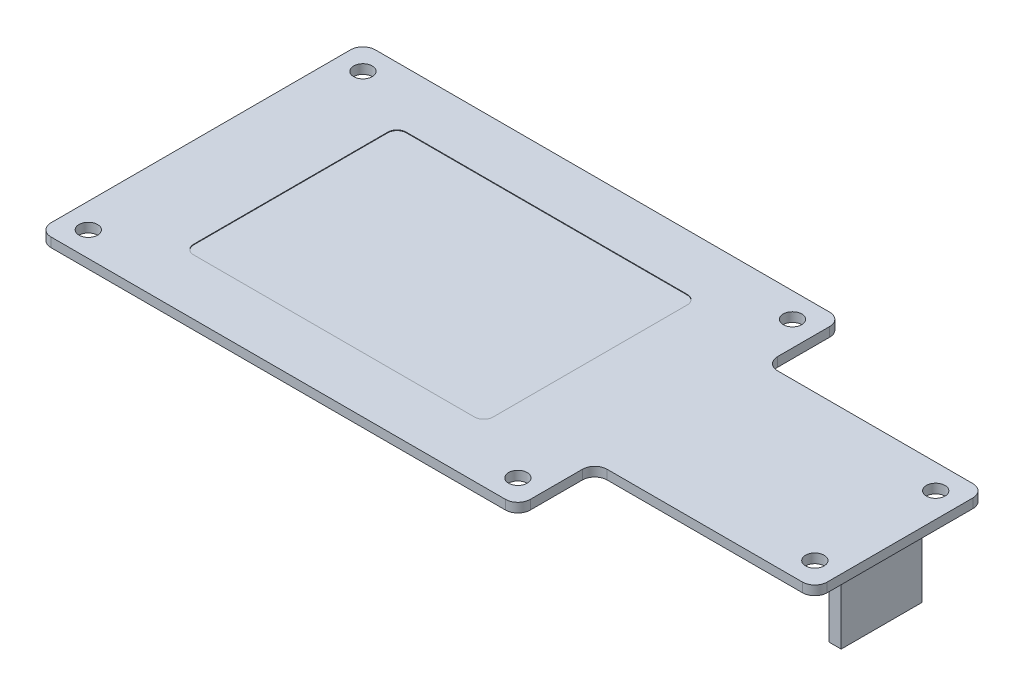
ISO-10303-21;
HEADER;
FILE_DESCRIPTION(('STEP AP214'),'2;1');
FILE_NAME('part.step','',(''),(''),'','','');
FILE_SCHEMA(('AUTOMOTIVE_DESIGN { 1 0 10303 214 1 1 1 1 }'));
ENDSEC;
DATA;
#1=APPLICATION_CONTEXT('core data for automotive mechanical design processes');
#2=APPLICATION_PROTOCOL_DEFINITION('international standard','automotive_design',2000,#1);
#3=PRODUCT_CONTEXT('',#1,'mechanical');
#4=PRODUCT('Part','Part','',(#3));
#5=PRODUCT_RELATED_PRODUCT_CATEGORY('part','',(#4));
#6=PRODUCT_DEFINITION_FORMATION('','',#4);
#7=PRODUCT_DEFINITION_CONTEXT('part definition',#1,'design');
#8=PRODUCT_DEFINITION('design','',#6,#7);
#9=PRODUCT_DEFINITION_SHAPE('','',#8);
#10=(LENGTH_UNIT() NAMED_UNIT(*) SI_UNIT(.MILLI.,.METRE.));
#11=(NAMED_UNIT(*) PLANE_ANGLE_UNIT() SI_UNIT($,.RADIAN.));
#12=(NAMED_UNIT(*) SI_UNIT($,.STERADIAN.) SOLID_ANGLE_UNIT());
#13=UNCERTAINTY_MEASURE_WITH_UNIT(LENGTH_MEASURE(1.E-05),#10,'distance_accuracy_value','');
#14=(GEOMETRIC_REPRESENTATION_CONTEXT(3) GLOBAL_UNCERTAINTY_ASSIGNED_CONTEXT((#13)) GLOBAL_UNIT_ASSIGNED_CONTEXT((#10,
#11,#12)) REPRESENTATION_CONTEXT('',''));
#15=CARTESIAN_POINT('',(0.,0.,0.));
#16=DIRECTION('',(0.,0.,1.));
#17=DIRECTION('',(1.,0.,0.));
#18=AXIS2_PLACEMENT_3D('',#15,#16,#17);
#19=CARTESIAN_POINT('',(0.,-0.75,0.));
#20=DIRECTION('',(0.,1.,0.));
#21=DIRECTION('',(0.,0.,1.));
#22=AXIS2_PLACEMENT_3D('',#19,#20,#21);
#23=PLANE('',#22);
#24=DIRECTION('',(0.,0.,1.));
#25=VECTOR('',#24,1.);
#26=CARTESIAN_POINT('',(-38.65,-0.75,26.15));
#27=LINE('',#26,#25);
#28=CARTESIAN_POINT('',(-38.65,-0.75,-24.15));
#29=VERTEX_POINT('',#28);
#30=CARTESIAN_POINT('',(-38.65,-0.75,24.15));
#31=VERTEX_POINT('',#30);
#32=EDGE_CURVE('E360',#29,#31,#27,.T.);
#33=ORIENTED_EDGE('',*,*,#32,.F.);
#34=CARTESIAN_POINT('',(-36.65,-0.75,-24.15));
#35=DIRECTION('',(0.,1.,0.));
#36=DIRECTION('',(0.,0.,1.));
#37=AXIS2_PLACEMENT_3D('',#34,#35,#36);
#38=CIRCLE('',#37,2.);
#39=CARTESIAN_POINT('',(-36.65,-0.75,-26.15));
#40=VERTEX_POINT('',#39);
#41=EDGE_CURVE('E391',#29,#40,#38,.F.);
#42=ORIENTED_EDGE('',*,*,#41,.T.);
#43=DIRECTION('',(-1.,0.,0.));
#44=VECTOR('',#43,1.);
#45=CARTESIAN_POINT('',(-38.65,-0.75,-26.15));
#46=LINE('',#45,#44);
#47=CARTESIAN_POINT('',(36.65,-0.75,-26.15));
#48=VERTEX_POINT('',#47);
#49=EDGE_CURVE('E357',#48,#40,#46,.T.);
#50=ORIENTED_EDGE('',*,*,#49,.F.);
#51=CARTESIAN_POINT('',(36.65,-0.75,-24.15));
#52=DIRECTION('',(0.,1.,0.));
#53=DIRECTION('',(0.,0.,1.));
#54=AXIS2_PLACEMENT_3D('',#51,#52,#53);
#55=CIRCLE('',#54,2.);
#56=CARTESIAN_POINT('',(38.65,-0.75,-24.15));
#57=VERTEX_POINT('',#56);
#58=EDGE_CURVE('E387',#48,#57,#55,.F.);
#59=ORIENTED_EDGE('',*,*,#58,.T.);
#60=DIRECTION('',(0.,0.,-1.));
#61=VECTOR('',#60,1.);
#62=CARTESIAN_POINT('',(38.65,-0.75,-26.15));
#63=LINE('',#62,#61);
#64=CARTESIAN_POINT('',(38.65,-0.75,-15.75));
#65=VERTEX_POINT('',#64);
#66=EDGE_CURVE('E328',#65,#57,#63,.T.);
#67=ORIENTED_EDGE('',*,*,#66,.F.);
#68=CARTESIAN_POINT('',(40.65,-0.75,-15.75));
#69=DIRECTION('',(0.,1.,0.));
#70=DIRECTION('',(0.,0.,1.));
#71=AXIS2_PLACEMENT_3D('',#68,#69,#70);
#72=CIRCLE('',#71,2.);
#73=CARTESIAN_POINT('',(40.65,-0.75,-13.75));
#74=VERTEX_POINT('',#73);
#75=EDGE_CURVE('E440',#65,#74,#72,.T.);
#76=ORIENTED_EDGE('',*,*,#75,.T.);
#77=DIRECTION('',(-1.,0.,0.));
#78=VECTOR('',#77,1.);
#79=CARTESIAN_POINT('',(38.65,-0.75,-13.75));
#80=LINE('',#79,#78);
#81=CARTESIAN_POINT('',(72.15,-0.75,-13.75));
#82=VERTEX_POINT('',#81);
#83=EDGE_CURVE('E333',#82,#74,#80,.T.);
#84=ORIENTED_EDGE('',*,*,#83,.F.);
#85=CARTESIAN_POINT('',(72.15,-0.75,-11.75));
#86=DIRECTION('',(0.,1.,0.));
#87=DIRECTION('',(0.,0.,1.));
#88=AXIS2_PLACEMENT_3D('',#85,#86,#87);
#89=CIRCLE('',#88,2.);
#90=CARTESIAN_POINT('',(74.15,-0.75,-11.75));
#91=VERTEX_POINT('',#90);
#92=EDGE_CURVE('E385',#82,#91,#89,.F.);
#93=ORIENTED_EDGE('',*,*,#92,.T.);
#94=DIRECTION('',(0.,0.,-1.));
#95=VECTOR('',#94,1.);
#96=CARTESIAN_POINT('',(74.15,-0.75,-13.75));
#97=LINE('',#96,#95);
#98=CARTESIAN_POINT('',(74.15,-0.75,11.75));
#99=VERTEX_POINT('',#98);
#100=EDGE_CURVE('E372',#99,#91,#97,.T.);
#101=ORIENTED_EDGE('',*,*,#100,.F.);
#102=CARTESIAN_POINT('',(72.15,-0.75,11.75));
#103=DIRECTION('',(0.,1.,0.));
#104=DIRECTION('',(0.,0.,1.));
#105=AXIS2_PLACEMENT_3D('',#102,#103,#104);
#106=CIRCLE('',#105,2.);
#107=CARTESIAN_POINT('',(72.15,-0.75,13.75));
#108=VERTEX_POINT('',#107);
#109=EDGE_CURVE('E383',#99,#108,#106,.F.);
#110=ORIENTED_EDGE('',*,*,#109,.T.);
#111=DIRECTION('',(1.,0.,0.));
#112=VECTOR('',#111,1.);
#113=CARTESIAN_POINT('',(74.15,-0.75,13.75));
#114=LINE('',#113,#112);
#115=CARTESIAN_POINT('',(40.65,-0.75,13.75));
#116=VERTEX_POINT('',#115);
#117=EDGE_CURVE('E369',#116,#108,#114,.T.);
#118=ORIENTED_EDGE('',*,*,#117,.F.);
#119=CARTESIAN_POINT('',(40.65,-0.75,15.75));
#120=DIRECTION('',(0.,1.,0.));
#121=DIRECTION('',(0.,0.,1.));
#122=AXIS2_PLACEMENT_3D('',#119,#120,#121);
#123=CIRCLE('',#122,2.);
#124=CARTESIAN_POINT('',(38.65,-0.75,15.75));
#125=VERTEX_POINT('',#124);
#126=EDGE_CURVE('E444',#116,#125,#123,.T.);
#127=ORIENTED_EDGE('',*,*,#126,.T.);
#128=DIRECTION('',(0.,0.,-1.));
#129=VECTOR('',#128,1.);
#130=CARTESIAN_POINT('',(38.65,-0.75,13.75));
#131=LINE('',#130,#129);
#132=CARTESIAN_POINT('',(38.65,-0.75,24.15));
#133=VERTEX_POINT('',#132);
#134=EDGE_CURVE('E366',#133,#125,#131,.T.);
#135=ORIENTED_EDGE('',*,*,#134,.F.);
#136=CARTESIAN_POINT('',(36.65,-0.75,24.15));
#137=DIRECTION('',(0.,1.,0.));
#138=DIRECTION('',(0.,0.,1.));
#139=AXIS2_PLACEMENT_3D('',#136,#137,#138);
#140=CIRCLE('',#139,2.);
#141=CARTESIAN_POINT('',(36.65,-0.75,26.15));
#142=VERTEX_POINT('',#141);
#143=EDGE_CURVE('E381',#133,#142,#140,.F.);
#144=ORIENTED_EDGE('',*,*,#143,.T.);
#145=DIRECTION('',(1.,0.,0.));
#146=VECTOR('',#145,1.);
#147=CARTESIAN_POINT('',(38.65,-0.75,26.15));
#148=LINE('',#147,#146);
#149=CARTESIAN_POINT('',(-36.65,-0.75,26.15));
#150=VERTEX_POINT('',#149);
#151=EDGE_CURVE('E363',#150,#142,#148,.T.);
#152=ORIENTED_EDGE('',*,*,#151,.F.);
#153=CARTESIAN_POINT('',(-36.65,-0.75,24.15));
#154=DIRECTION('',(0.,1.,0.));
#155=DIRECTION('',(0.,0.,1.));
#156=AXIS2_PLACEMENT_3D('',#153,#154,#155);
#157=CIRCLE('',#156,2.);
#158=EDGE_CURVE('E389',#150,#31,#157,.F.);
#159=ORIENTED_EDGE('',*,*,#158,.T.);
#160=EDGE_LOOP('',(#33,#42,#50,#59,#67,#76,#84,#93,#101,#110,#118,#127,#135,#144,#152,#159));
#161=FACE_BOUND('',#160,.T.);
#162=CARTESIAN_POINT('',(-34.65,-0.75,-22.15));
#163=DIRECTION('',(0.,1.,0.));
#164=DIRECTION('',(0.,0.,1.));
#165=AXIS2_PLACEMENT_3D('',#162,#163,#164);
#166=CIRCLE('',#165,1.5);
#167=CARTESIAN_POINT('',(-34.65,-0.75,-20.65));
#168=VERTEX_POINT('',#167);
#169=EDGE_CURVE('E325',#168,#168,#166,.F.);
#170=ORIENTED_EDGE('',*,*,#169,.F.);
#171=EDGE_LOOP('',(#170));
#172=FACE_BOUND('',#171,.T.);
#173=CARTESIAN_POINT('',(34.65,-0.75,-22.15));
#174=DIRECTION('',(0.,1.,0.));
#175=DIRECTION('',(0.,0.,1.));
#176=AXIS2_PLACEMENT_3D('',#173,#174,#175);
#177=CIRCLE('',#176,1.5);
#178=CARTESIAN_POINT('',(34.65,-0.75,-20.65));
#179=VERTEX_POINT('',#178);
#180=EDGE_CURVE('E314',#179,#179,#177,.F.);
#181=ORIENTED_EDGE('',*,*,#180,.F.);
#182=EDGE_LOOP('',(#181));
#183=FACE_BOUND('',#182,.T.);
#184=CARTESIAN_POINT('',(34.65,-0.75,22.15));
#185=DIRECTION('',(0.,1.,0.));
#186=DIRECTION('',(0.,0.,1.));
#187=AXIS2_PLACEMENT_3D('',#184,#185,#186);
#188=CIRCLE('',#187,1.5);
#189=CARTESIAN_POINT('',(34.65,-0.75,23.65));
#190=VERTEX_POINT('',#189);
#191=EDGE_CURVE('E315',#190,#190,#188,.F.);
#192=ORIENTED_EDGE('',*,*,#191,.F.);
#193=EDGE_LOOP('',(#192));
#194=FACE_BOUND('',#193,.T.);
#195=CARTESIAN_POINT('',(-34.65,-0.75,22.15));
#196=DIRECTION('',(0.,1.,0.));
#197=DIRECTION('',(0.,0.,1.));
#198=AXIS2_PLACEMENT_3D('',#195,#196,#197);
#199=CIRCLE('',#198,1.5);
#200=CARTESIAN_POINT('',(-34.65,-0.75,23.65));
#201=VERTEX_POINT('',#200);
#202=EDGE_CURVE('E296',#201,#201,#199,.F.);
#203=ORIENTED_EDGE('',*,*,#202,.F.);
#204=EDGE_LOOP('',(#203));
#205=FACE_BOUND('',#204,.T.);
#206=CARTESIAN_POINT('',(70.15,-0.75,-9.75));
#207=DIRECTION('',(0.,1.,0.));
#208=DIRECTION('',(0.,0.,1.));
#209=AXIS2_PLACEMENT_3D('',#206,#207,#208);
#210=CIRCLE('',#209,1.5);
#211=CARTESIAN_POINT('',(70.15,-0.75,-8.25));
#212=VERTEX_POINT('',#211);
#213=EDGE_CURVE('E297',#212,#212,#210,.F.);
#214=ORIENTED_EDGE('',*,*,#213,.F.);
#215=EDGE_LOOP('',(#214));
#216=FACE_BOUND('',#215,.T.);
#217=CARTESIAN_POINT('',(70.15,-0.75,9.75));
#218=DIRECTION('',(0.,1.,0.));
#219=DIRECTION('',(0.,0.,1.));
#220=AXIS2_PLACEMENT_3D('',#217,#218,#219);
#221=CIRCLE('',#220,1.5);
#222=CARTESIAN_POINT('',(70.15,-0.75,11.25));
#223=VERTEX_POINT('',#222);
#224=EDGE_CURVE('E304',#223,#223,#221,.F.);
#225=ORIENTED_EDGE('',*,*,#224,.F.);
#226=EDGE_LOOP('',(#225));
#227=FACE_BOUND('',#226,.T.);
#228=DIRECTION('',(0.,0.,1.));
#229=VECTOR('',#228,1.);
#230=CARTESIAN_POINT('',(71.15,-0.75,6.5));
#231=LINE('',#230,#229);
#232=CARTESIAN_POINT('',(71.15,-0.75,-6.5));
#233=VERTEX_POINT('',#232);
#234=CARTESIAN_POINT('',(71.15,-0.75,6.5));
#235=VERTEX_POINT('',#234);
#236=EDGE_CURVE('E239',#233,#235,#231,.T.);
#237=ORIENTED_EDGE('',*,*,#236,.F.);
#238=DIRECTION('',(1.,0.,0.));
#239=VECTOR('',#238,1.);
#240=CARTESIAN_POINT('',(71.15,-0.75,-6.5));
#241=LINE('',#240,#239);
#242=CARTESIAN_POINT('',(69.15,-0.75,-6.5));
#243=VERTEX_POINT('',#242);
#244=EDGE_CURVE('E236',#243,#233,#241,.T.);
#245=ORIENTED_EDGE('',*,*,#244,.F.);
#246=DIRECTION('',(0.,0.,-1.));
#247=VECTOR('',#246,1.);
#248=CARTESIAN_POINT('',(69.15,-0.75,6.5));
#249=LINE('',#248,#247);
#250=CARTESIAN_POINT('',(69.15,-0.75,6.5));
#251=VERTEX_POINT('',#250);
#252=EDGE_CURVE('E54',#251,#243,#249,.T.);
#253=ORIENTED_EDGE('',*,*,#252,.F.);
#254=DIRECTION('',(-1.,0.,0.));
#255=VECTOR('',#254,1.);
#256=CARTESIAN_POINT('',(71.15,-0.75,6.5));
#257=LINE('',#256,#255);
#258=EDGE_CURVE('E49',#235,#251,#257,.T.);
#259=ORIENTED_EDGE('',*,*,#258,.F.);
#260=EDGE_LOOP('',(#237,#245,#253,#259));
#261=FACE_BOUND('',#260,.T.);
#262=ADVANCED_FACE('F34',(#161,#172,#183,#194,#205,#216,#227,#261),#23,.F.);
#263=CARTESIAN_POINT('',(38.65,0.75,-26.15));
#264=DIRECTION('',(-1.,0.,0.));
#265=DIRECTION('',(0.,0.,1.));
#266=AXIS2_PLACEMENT_3D('',#263,#264,#265);
#267=PLANE('',#266);
#268=DIRECTION('',(0.,0.,-1.));
#269=VECTOR('',#268,1.);
#270=CARTESIAN_POINT('',(38.65,0.75,-26.15));
#271=LINE('',#270,#269);
#272=CARTESIAN_POINT('',(38.65,0.75,-15.75));
#273=VERTEX_POINT('',#272);
#274=CARTESIAN_POINT('',(38.65,0.75,-24.15));
#275=VERTEX_POINT('',#274);
#276=EDGE_CURVE('E329',#273,#275,#271,.T.);
#277=ORIENTED_EDGE('',*,*,#276,.F.);
#278=DIRECTION('',(0.,-1.,0.));
#279=VECTOR('',#278,1.);
#280=CARTESIAN_POINT('',(38.65,-0.75,-15.75));
#281=LINE('',#280,#279);
#282=EDGE_CURVE('E412',#273,#65,#281,.T.);
#283=ORIENTED_EDGE('',*,*,#282,.T.);
#284=ORIENTED_EDGE('',*,*,#66,.T.);
#285=DIRECTION('',(0.,-1.,0.));
#286=VECTOR('',#285,1.);
#287=CARTESIAN_POINT('',(38.65,0.75,-24.15));
#288=LINE('',#287,#286);
#289=EDGE_CURVE('E410',#57,#275,#288,.F.);
#290=ORIENTED_EDGE('',*,*,#289,.T.);
#291=EDGE_LOOP('',(#277,#283,#284,#290));
#292=FACE_BOUND('',#291,.T.);
#293=ADVANCED_FACE('F505',(#292),#267,.F.);
#294=CARTESIAN_POINT('',(-38.65,0.75,-26.15));
#295=DIRECTION('',(0.,0.,1.));
#296=DIRECTION('',(1.,0.,0.));
#297=AXIS2_PLACEMENT_3D('',#294,#295,#296);
#298=PLANE('',#297);
#299=ORIENTED_EDGE('',*,*,#49,.T.);
#300=DIRECTION('',(0.,-1.,0.));
#301=VECTOR('',#300,1.);
#302=CARTESIAN_POINT('',(-36.65,0.75,-26.15));
#303=LINE('',#302,#301);
#304=CARTESIAN_POINT('',(-36.65,0.75,-26.15));
#305=VERTEX_POINT('',#304);
#306=EDGE_CURVE('E396',#40,#305,#303,.F.);
#307=ORIENTED_EDGE('',*,*,#306,.T.);
#308=DIRECTION('',(-1.,0.,0.));
#309=VECTOR('',#308,1.);
#310=CARTESIAN_POINT('',(-38.65,0.75,-26.15));
#311=LINE('',#310,#309);
#312=CARTESIAN_POINT('',(36.65,0.75,-26.15));
#313=VERTEX_POINT('',#312);
#314=EDGE_CURVE('E332',#313,#305,#311,.T.);
#315=ORIENTED_EDGE('',*,*,#314,.F.);
#316=DIRECTION('',(0.,-1.,0.));
#317=VECTOR('',#316,1.);
#318=CARTESIAN_POINT('',(36.65,0.75,-26.15));
#319=LINE('',#318,#317);
#320=EDGE_CURVE('E393',#313,#48,#319,.T.);
#321=ORIENTED_EDGE('',*,*,#320,.T.);
#322=EDGE_LOOP('',(#299,#307,#315,#321));
#323=FACE_BOUND('',#322,.T.);
#324=ADVANCED_FACE('F511',(#323),#298,.F.);
#325=CARTESIAN_POINT('',(-38.65,0.75,26.15));
#326=DIRECTION('',(1.,0.,0.));
#327=DIRECTION('',(0.,0.,-1.));
#328=AXIS2_PLACEMENT_3D('',#325,#326,#327);
#329=PLANE('',#328);
#330=DIRECTION('',(0.,0.,1.));
#331=VECTOR('',#330,1.);
#332=CARTESIAN_POINT('',(-38.65,0.75,26.15));
#333=LINE('',#332,#331);
#334=CARTESIAN_POINT('',(-38.65,0.75,-24.15));
#335=VERTEX_POINT('',#334);
#336=CARTESIAN_POINT('',(-38.65,0.75,24.15));
#337=VERTEX_POINT('',#336);
#338=EDGE_CURVE('E336',#335,#337,#333,.T.);
#339=ORIENTED_EDGE('',*,*,#338,.F.);
#340=DIRECTION('',(0.,-1.,0.));
#341=VECTOR('',#340,1.);
#342=CARTESIAN_POINT('',(-38.65,0.75,-24.15));
#343=LINE('',#342,#341);
#344=EDGE_CURVE('E378',#335,#29,#343,.T.);
#345=ORIENTED_EDGE('',*,*,#344,.T.);
#346=ORIENTED_EDGE('',*,*,#32,.T.);
#347=DIRECTION('',(0.,-1.,0.));
#348=VECTOR('',#347,1.);
#349=CARTESIAN_POINT('',(-38.65,0.75,24.15));
#350=LINE('',#349,#348);
#351=EDGE_CURVE('E354',#31,#337,#350,.F.);
#352=ORIENTED_EDGE('',*,*,#351,.T.);
#353=EDGE_LOOP('',(#339,#345,#346,#352));
#354=FACE_BOUND('',#353,.T.);
#355=ADVANCED_FACE('F538',(#354),#329,.F.);
#356=CARTESIAN_POINT('',(38.65,0.75,26.15));
#357=DIRECTION('',(0.,0.,-1.));
#358=DIRECTION('',(-1.,0.,0.));
#359=AXIS2_PLACEMENT_3D('',#356,#357,#358);
#360=PLANE('',#359);
#361=DIRECTION('',(1.,0.,0.));
#362=VECTOR('',#361,1.);
#363=CARTESIAN_POINT('',(38.65,0.75,26.15));
#364=LINE('',#363,#362);
#365=CARTESIAN_POINT('',(-36.65,0.75,26.15));
#366=VERTEX_POINT('',#365);
#367=CARTESIAN_POINT('',(36.65,0.75,26.15));
#368=VERTEX_POINT('',#367);
#369=EDGE_CURVE('E339',#366,#368,#364,.T.);
#370=ORIENTED_EDGE('',*,*,#369,.F.);
#371=DIRECTION('',(0.,-1.,0.));
#372=VECTOR('',#371,1.);
#373=CARTESIAN_POINT('',(-36.65,0.75,26.15));
#374=LINE('',#373,#372);
#375=EDGE_CURVE('E422',#366,#150,#374,.T.);
#376=ORIENTED_EDGE('',*,*,#375,.T.);
#377=ORIENTED_EDGE('',*,*,#151,.T.);
#378=DIRECTION('',(0.,-1.,0.));
#379=VECTOR('',#378,1.);
#380=CARTESIAN_POINT('',(36.65,0.75,26.15));
#381=LINE('',#380,#379);
#382=EDGE_CURVE('E420',#142,#368,#381,.F.);
#383=ORIENTED_EDGE('',*,*,#382,.T.);
#384=EDGE_LOOP('',(#370,#376,#377,#383));
#385=FACE_BOUND('',#384,.T.);
#386=ADVANCED_FACE('F534',(#385),#360,.F.);
#387=CARTESIAN_POINT('',(38.65,0.75,13.75));
#388=DIRECTION('',(-1.,0.,0.));
#389=DIRECTION('',(0.,0.,1.));
#390=AXIS2_PLACEMENT_3D('',#387,#388,#389);
#391=PLANE('',#390);
#392=ORIENTED_EDGE('',*,*,#134,.T.);
#393=DIRECTION('',(0.,-1.,0.));
#394=VECTOR('',#393,1.);
#395=CARTESIAN_POINT('',(38.65,0.75,15.75));
#396=LINE('',#395,#394);
#397=CARTESIAN_POINT('',(38.65,0.75,15.75));
#398=VERTEX_POINT('',#397);
#399=EDGE_CURVE('E438',#125,#398,#396,.F.);
#400=ORIENTED_EDGE('',*,*,#399,.T.);
#401=DIRECTION('',(0.,0.,-1.));
#402=VECTOR('',#401,1.);
#403=CARTESIAN_POINT('',(38.65,0.75,13.75));
#404=LINE('',#403,#402);
#405=CARTESIAN_POINT('',(38.65,0.75,24.15));
#406=VERTEX_POINT('',#405);
#407=EDGE_CURVE('E342',#406,#398,#404,.T.);
#408=ORIENTED_EDGE('',*,*,#407,.F.);
#409=DIRECTION('',(0.,-1.,0.));
#410=VECTOR('',#409,1.);
#411=CARTESIAN_POINT('',(38.65,0.75,24.15));
#412=LINE('',#411,#410);
#413=EDGE_CURVE('E435',#406,#133,#412,.T.);
#414=ORIENTED_EDGE('',*,*,#413,.T.);
#415=EDGE_LOOP('',(#392,#400,#408,#414));
#416=FACE_BOUND('',#415,.T.);
#417=ADVANCED_FACE('F530',(#416),#391,.F.);
#418=CARTESIAN_POINT('',(74.15,0.75,13.75));
#419=DIRECTION('',(0.,0.,-1.));
#420=DIRECTION('',(-1.,0.,0.));
#421=AXIS2_PLACEMENT_3D('',#418,#419,#420);
#422=PLANE('',#421);
#423=ORIENTED_EDGE('',*,*,#117,.T.);
#424=DIRECTION('',(0.,-1.,0.));
#425=VECTOR('',#424,1.);
#426=CARTESIAN_POINT('',(72.15,0.75,13.75));
#427=LINE('',#426,#425);
#428=CARTESIAN_POINT('',(72.15,0.75,13.75));
#429=VERTEX_POINT('',#428);
#430=EDGE_CURVE('E433',#108,#429,#427,.F.);
#431=ORIENTED_EDGE('',*,*,#430,.T.);
#432=DIRECTION('',(1.,0.,0.));
#433=VECTOR('',#432,1.);
#434=CARTESIAN_POINT('',(74.15,0.75,13.75));
#435=LINE('',#434,#433);
#436=CARTESIAN_POINT('',(40.65,0.75,13.75));
#437=VERTEX_POINT('',#436);
#438=EDGE_CURVE('E345',#437,#429,#435,.T.);
#439=ORIENTED_EDGE('',*,*,#438,.F.);
#440=DIRECTION('',(0.,-1.,0.));
#441=VECTOR('',#440,1.);
#442=CARTESIAN_POINT('',(40.65,-0.75,13.75));
#443=LINE('',#442,#441);
#444=EDGE_CURVE('E430',#437,#116,#443,.T.);
#445=ORIENTED_EDGE('',*,*,#444,.T.);
#446=EDGE_LOOP('',(#423,#431,#439,#445));
#447=FACE_BOUND('',#446,.T.);
#448=ADVANCED_FACE('F526',(#447),#422,.F.);
#449=CARTESIAN_POINT('',(74.15,0.75,-13.75));
#450=DIRECTION('',(-1.,0.,0.));
#451=DIRECTION('',(0.,0.,1.));
#452=AXIS2_PLACEMENT_3D('',#449,#450,#451);
#453=PLANE('',#452);
#454=ORIENTED_EDGE('',*,*,#100,.T.);
#455=DIRECTION('',(0.,-1.,0.));
#456=VECTOR('',#455,1.);
#457=CARTESIAN_POINT('',(74.15,0.75,-11.75));
#458=LINE('',#457,#456);
#459=CARTESIAN_POINT('',(74.15,0.75,-11.75));
#460=VERTEX_POINT('',#459);
#461=EDGE_CURVE('E428',#91,#460,#458,.F.);
#462=ORIENTED_EDGE('',*,*,#461,.T.);
#463=DIRECTION('',(0.,0.,-1.));
#464=VECTOR('',#463,1.);
#465=CARTESIAN_POINT('',(74.15,0.75,-13.75));
#466=LINE('',#465,#464);
#467=CARTESIAN_POINT('',(74.15,0.75,11.75));
#468=VERTEX_POINT('',#467);
#469=EDGE_CURVE('E348',#468,#460,#466,.T.);
#470=ORIENTED_EDGE('',*,*,#469,.F.);
#471=DIRECTION('',(0.,-1.,0.));
#472=VECTOR('',#471,1.);
#473=CARTESIAN_POINT('',(74.15,0.75,11.75));
#474=LINE('',#473,#472);
#475=EDGE_CURVE('E425',#468,#99,#474,.T.);
#476=ORIENTED_EDGE('',*,*,#475,.T.);
#477=EDGE_LOOP('',(#454,#462,#470,#476));
#478=FACE_BOUND('',#477,.T.);
#479=ADVANCED_FACE('F522',(#478),#453,.F.);
#480=CARTESIAN_POINT('',(38.65,0.75,-13.75));
#481=DIRECTION('',(0.,0.,1.));
#482=DIRECTION('',(1.,0.,0.));
#483=AXIS2_PLACEMENT_3D('',#480,#481,#482);
#484=PLANE('',#483);
#485=ORIENTED_EDGE('',*,*,#83,.T.);
#486=DIRECTION('',(0.,-1.,0.));
#487=VECTOR('',#486,1.);
#488=CARTESIAN_POINT('',(40.65,0.75,-13.75));
#489=LINE('',#488,#487);
#490=CARTESIAN_POINT('',(40.65,0.75,-13.75));
#491=VERTEX_POINT('',#490);
#492=EDGE_CURVE('E418',#74,#491,#489,.F.);
#493=ORIENTED_EDGE('',*,*,#492,.T.);
#494=DIRECTION('',(-1.,0.,0.));
#495=VECTOR('',#494,1.);
#496=CARTESIAN_POINT('',(38.65,0.75,-13.75));
#497=LINE('',#496,#495);
#498=CARTESIAN_POINT('',(72.15,0.75,-13.75));
#499=VERTEX_POINT('',#498);
#500=EDGE_CURVE('E351',#499,#491,#497,.T.);
#501=ORIENTED_EDGE('',*,*,#500,.F.);
#502=DIRECTION('',(0.,-1.,0.));
#503=VECTOR('',#502,1.);
#504=CARTESIAN_POINT('',(72.15,0.75,-13.75));
#505=LINE('',#504,#503);
#506=EDGE_CURVE('E415',#499,#82,#505,.T.);
#507=ORIENTED_EDGE('',*,*,#506,.T.);
#508=EDGE_LOOP('',(#485,#493,#501,#507));
#509=FACE_BOUND('',#508,.T.);
#510=ADVANCED_FACE('F519',(#509),#484,.F.);
#511=CARTESIAN_POINT('',(0.,0.75,0.));
#512=DIRECTION('',(0.,1.,0.));
#513=DIRECTION('',(0.,0.,1.));
#514=AXIS2_PLACEMENT_3D('',#511,#512,#513);
#515=PLANE('',#514);
#516=CARTESIAN_POINT('',(-22.65,0.75,15.65));
#517=DIRECTION('',(0.,1.,0.));
#518=DIRECTION('',(0.,0.,1.));
#519=AXIS2_PLACEMENT_3D('',#516,#517,#518);
#520=CIRCLE('',#519,1.5);
#521=CARTESIAN_POINT('',(-24.15,0.75,15.65));
#522=VERTEX_POINT('',#521);
#523=CARTESIAN_POINT('',(-22.65,0.75,17.15));
#524=VERTEX_POINT('',#523);
#525=EDGE_CURVE('E11',#522,#524,#520,.T.);
#526=ORIENTED_EDGE('',*,*,#525,.F.);
#527=DIRECTION('',(0.,0.,1.));
#528=VECTOR('',#527,1.);
#529=CARTESIAN_POINT('',(-24.15,0.75,0.));
#530=LINE('',#529,#528);
#531=CARTESIAN_POINT('',(-24.15,0.75,-15.65));
#532=VERTEX_POINT('',#531);
#533=EDGE_CURVE('E42',#532,#522,#530,.T.);
#534=ORIENTED_EDGE('',*,*,#533,.F.);
#535=CARTESIAN_POINT('',(-22.65,0.75,-15.65));
#536=DIRECTION('',(0.,1.,0.));
#537=DIRECTION('',(0.,0.,1.));
#538=AXIS2_PLACEMENT_3D('',#535,#536,#537);
#539=CIRCLE('',#538,1.5);
#540=CARTESIAN_POINT('',(-22.65,0.75,-17.15));
#541=VERTEX_POINT('',#540);
#542=EDGE_CURVE('E458',#541,#532,#539,.T.);
#543=ORIENTED_EDGE('',*,*,#542,.F.);
#544=DIRECTION('',(-1.,0.,0.));
#545=VECTOR('',#544,1.);
#546=CARTESIAN_POINT('',(0.,0.75,-17.15));
#547=LINE('',#546,#545);
#548=CARTESIAN_POINT('',(22.65,0.75,-17.15));
#549=VERTEX_POINT('',#548);
#550=EDGE_CURVE('E456',#549,#541,#547,.T.);
#551=ORIENTED_EDGE('',*,*,#550,.F.);
#552=CARTESIAN_POINT('',(22.65,0.75,-15.65));
#553=DIRECTION('',(0.,1.,0.));
#554=DIRECTION('',(0.,0.,1.));
#555=AXIS2_PLACEMENT_3D('',#552,#553,#554);
#556=CIRCLE('',#555,1.5);
#557=CARTESIAN_POINT('',(24.15,0.75,-15.65));
#558=VERTEX_POINT('',#557);
#559=EDGE_CURVE('E454',#558,#549,#556,.T.);
#560=ORIENTED_EDGE('',*,*,#559,.F.);
#561=DIRECTION('',(0.,0.,-1.));
#562=VECTOR('',#561,1.);
#563=CARTESIAN_POINT('',(24.15,0.75,0.));
#564=LINE('',#563,#562);
#565=CARTESIAN_POINT('',(24.15,0.75,15.65));
#566=VERTEX_POINT('',#565);
#567=EDGE_CURVE('E452',#566,#558,#564,.T.);
#568=ORIENTED_EDGE('',*,*,#567,.F.);
#569=CARTESIAN_POINT('',(22.65,0.75,15.65));
#570=DIRECTION('',(0.,1.,0.));
#571=DIRECTION('',(0.,0.,1.));
#572=AXIS2_PLACEMENT_3D('',#569,#570,#571);
#573=CIRCLE('',#572,1.5);
#574=CARTESIAN_POINT('',(22.65,0.75,17.15));
#575=VERTEX_POINT('',#574);
#576=EDGE_CURVE('E450',#575,#566,#573,.T.);
#577=ORIENTED_EDGE('',*,*,#576,.F.);
#578=DIRECTION('',(1.,0.,0.));
#579=VECTOR('',#578,1.);
#580=CARTESIAN_POINT('',(0.,0.75,17.15));
#581=LINE('',#580,#579);
#582=EDGE_CURVE('E448',#524,#575,#581,.T.);
#583=ORIENTED_EDGE('',*,*,#582,.F.);
#584=EDGE_LOOP('',(#526,#534,#543,#551,#560,#568,#577,#583));
#585=FACE_BOUND('',#584,.T.);
#586=CARTESIAN_POINT('',(70.15,0.75,9.75));
#587=DIRECTION('',(0.,1.,0.));
#588=DIRECTION('',(0.,0.,1.));
#589=AXIS2_PLACEMENT_3D('',#586,#587,#588);
#590=CIRCLE('',#589,1.5);
#591=CARTESIAN_POINT('',(70.15,0.75,11.25));
#592=VERTEX_POINT('',#591);
#593=EDGE_CURVE('E273',#592,#592,#590,.T.);
#594=ORIENTED_EDGE('',*,*,#593,.F.);
#595=EDGE_LOOP('',(#594));
#596=FACE_BOUND('',#595,.T.);
#597=CARTESIAN_POINT('',(70.15,0.75,-9.75));
#598=DIRECTION('',(0.,1.,0.));
#599=DIRECTION('',(0.,0.,1.));
#600=AXIS2_PLACEMENT_3D('',#597,#598,#599);
#601=CIRCLE('',#600,1.5);
#602=CARTESIAN_POINT('',(70.15,0.75,-8.25));
#603=VERTEX_POINT('',#602);
#604=EDGE_CURVE('E301',#603,#603,#601,.T.);
#605=ORIENTED_EDGE('',*,*,#604,.F.);
#606=EDGE_LOOP('',(#605));
#607=FACE_BOUND('',#606,.T.);
#608=CARTESIAN_POINT('',(-34.65,0.75,22.15));
#609=DIRECTION('',(0.,1.,0.));
#610=DIRECTION('',(0.,0.,1.));
#611=AXIS2_PLACEMENT_3D('',#608,#609,#610);
#612=CIRCLE('',#611,1.5);
#613=CARTESIAN_POINT('',(-34.65,0.75,23.65));
#614=VERTEX_POINT('',#613);
#615=EDGE_CURVE('E293',#614,#614,#612,.T.);
#616=ORIENTED_EDGE('',*,*,#615,.F.);
#617=EDGE_LOOP('',(#616));
#618=FACE_BOUND('',#617,.T.);
#619=CARTESIAN_POINT('',(34.65,0.75,22.15));
#620=DIRECTION('',(0.,1.,0.));
#621=DIRECTION('',(0.,0.,1.));
#622=AXIS2_PLACEMENT_3D('',#619,#620,#621);
#623=CIRCLE('',#622,1.5);
#624=CARTESIAN_POINT('',(34.65,0.75,23.65));
#625=VERTEX_POINT('',#624);
#626=EDGE_CURVE('E300',#625,#625,#623,.T.);
#627=ORIENTED_EDGE('',*,*,#626,.F.);
#628=EDGE_LOOP('',(#627));
#629=FACE_BOUND('',#628,.T.);
#630=CARTESIAN_POINT('',(34.65,0.75,-22.15));
#631=DIRECTION('',(0.,1.,0.));
#632=DIRECTION('',(0.,0.,1.));
#633=AXIS2_PLACEMENT_3D('',#630,#631,#632);
#634=CIRCLE('',#633,1.5);
#635=CARTESIAN_POINT('',(34.65,0.75,-20.65));
#636=VERTEX_POINT('',#635);
#637=EDGE_CURVE('E311',#636,#636,#634,.T.);
#638=ORIENTED_EDGE('',*,*,#637,.F.);
#639=EDGE_LOOP('',(#638));
#640=FACE_BOUND('',#639,.T.);
#641=CARTESIAN_POINT('',(-34.65,0.75,-22.15));
#642=DIRECTION('',(0.,1.,0.));
#643=DIRECTION('',(0.,0.,1.));
#644=AXIS2_PLACEMENT_3D('',#641,#642,#643);
#645=CIRCLE('',#644,1.5);
#646=CARTESIAN_POINT('',(-34.65,0.75,-20.65));
#647=VERTEX_POINT('',#646);
#648=EDGE_CURVE('E318',#647,#647,#645,.T.);
#649=ORIENTED_EDGE('',*,*,#648,.F.);
#650=EDGE_LOOP('',(#649));
#651=FACE_BOUND('',#650,.T.);
#652=ORIENTED_EDGE('',*,*,#314,.T.);
#653=CARTESIAN_POINT('',(-36.65,0.75,-24.15));
#654=DIRECTION('',(0.,1.,0.));
#655=DIRECTION('',(0.,0.,1.));
#656=AXIS2_PLACEMENT_3D('',#653,#654,#655);
#657=CIRCLE('',#656,2.);
#658=EDGE_CURVE('E408',#305,#335,#657,.T.);
#659=ORIENTED_EDGE('',*,*,#658,.T.);
#660=ORIENTED_EDGE('',*,*,#338,.T.);
#661=CARTESIAN_POINT('',(-36.65,0.75,24.15));
#662=DIRECTION('',(0.,1.,0.));
#663=DIRECTION('',(0.,0.,1.));
#664=AXIS2_PLACEMENT_3D('',#661,#662,#663);
#665=CIRCLE('',#664,2.);
#666=EDGE_CURVE('E406',#337,#366,#665,.T.);
#667=ORIENTED_EDGE('',*,*,#666,.T.);
#668=ORIENTED_EDGE('',*,*,#369,.T.);
#669=CARTESIAN_POINT('',(36.65,0.75,24.15));
#670=DIRECTION('',(0.,1.,0.));
#671=DIRECTION('',(0.,0.,1.));
#672=AXIS2_PLACEMENT_3D('',#669,#670,#671);
#673=CIRCLE('',#672,2.);
#674=EDGE_CURVE('E398',#368,#406,#673,.T.);
#675=ORIENTED_EDGE('',*,*,#674,.T.);
#676=ORIENTED_EDGE('',*,*,#407,.T.);
#677=CARTESIAN_POINT('',(40.65,0.75,15.75));
#678=DIRECTION('',(0.,1.,0.));
#679=DIRECTION('',(0.,0.,1.));
#680=AXIS2_PLACEMENT_3D('',#677,#678,#679);
#681=CIRCLE('',#680,2.);
#682=EDGE_CURVE('E446',#398,#437,#681,.F.);
#683=ORIENTED_EDGE('',*,*,#682,.T.);
#684=ORIENTED_EDGE('',*,*,#438,.T.);
#685=CARTESIAN_POINT('',(72.15,0.75,11.75));
#686=DIRECTION('',(0.,1.,0.));
#687=DIRECTION('',(0.,0.,1.));
#688=AXIS2_PLACEMENT_3D('',#685,#686,#687);
#689=CIRCLE('',#688,2.);
#690=EDGE_CURVE('E400',#429,#468,#689,.T.);
#691=ORIENTED_EDGE('',*,*,#690,.T.);
#692=ORIENTED_EDGE('',*,*,#469,.T.);
#693=CARTESIAN_POINT('',(72.15,0.75,-11.75));
#694=DIRECTION('',(0.,1.,0.));
#695=DIRECTION('',(0.,0.,1.));
#696=AXIS2_PLACEMENT_3D('',#693,#694,#695);
#697=CIRCLE('',#696,2.);
#698=EDGE_CURVE('E402',#460,#499,#697,.T.);
#699=ORIENTED_EDGE('',*,*,#698,.T.);
#700=ORIENTED_EDGE('',*,*,#500,.T.);
#701=CARTESIAN_POINT('',(40.65,0.75,-15.75));
#702=DIRECTION('',(0.,1.,0.));
#703=DIRECTION('',(0.,0.,1.));
#704=AXIS2_PLACEMENT_3D('',#701,#702,#703);
#705=CIRCLE('',#704,2.);
#706=EDGE_CURVE('E442',#491,#273,#705,.F.);
#707=ORIENTED_EDGE('',*,*,#706,.T.);
#708=ORIENTED_EDGE('',*,*,#276,.T.);
#709=CARTESIAN_POINT('',(36.65,0.75,-24.15));
#710=DIRECTION('',(0.,1.,0.));
#711=DIRECTION('',(0.,0.,1.));
#712=AXIS2_PLACEMENT_3D('',#709,#710,#711);
#713=CIRCLE('',#712,2.);
#714=EDGE_CURVE('E404',#275,#313,#713,.T.);
#715=ORIENTED_EDGE('',*,*,#714,.T.);
#716=EDGE_LOOP('',(#652,#659,#660,#667,#668,#675,#676,#683,#684,#691,#692,#699,#700,#707,#708,#715));
#717=FACE_BOUND('',#716,.T.);
#718=ADVANCED_FACE('F470',(#585,#596,#607,#618,#629,#640,#651,#717),#515,.T.);
#719=CARTESIAN_POINT('',(-36.65,0.75,-24.15));
#720=DIRECTION('',(0.,-1.,0.));
#721=DIRECTION('',(0.,0.,-1.));
#722=AXIS2_PLACEMENT_3D('',#719,#720,#721);
#723=CYLINDRICAL_SURFACE('',#722,2.);
#724=ORIENTED_EDGE('',*,*,#658,.F.);
#725=ORIENTED_EDGE('',*,*,#306,.F.);
#726=ORIENTED_EDGE('',*,*,#41,.F.);
#727=ORIENTED_EDGE('',*,*,#344,.F.);
#728=EDGE_LOOP('',(#724,#725,#726,#727));
#729=FACE_BOUND('',#728,.T.);
#730=ADVANCED_FACE('F546',(#729),#723,.T.);
#731=CARTESIAN_POINT('',(40.65,0.75,-15.75));
#732=DIRECTION('',(0.,1.,0.));
#733=DIRECTION('',(0.,0.,1.));
#734=AXIS2_PLACEMENT_3D('',#731,#732,#733);
#735=CYLINDRICAL_SURFACE('',#734,2.);
#736=ORIENTED_EDGE('',*,*,#706,.F.);
#737=ORIENTED_EDGE('',*,*,#492,.F.);
#738=ORIENTED_EDGE('',*,*,#75,.F.);
#739=ORIENTED_EDGE('',*,*,#282,.F.);
#740=EDGE_LOOP('',(#736,#737,#738,#739));
#741=FACE_BOUND('',#740,.T.);
#742=ADVANCED_FACE('F549',(#741),#735,.F.);
#743=CARTESIAN_POINT('',(-36.65,0.75,24.15));
#744=DIRECTION('',(0.,-1.,0.));
#745=DIRECTION('',(0.,0.,-1.));
#746=AXIS2_PLACEMENT_3D('',#743,#744,#745);
#747=CYLINDRICAL_SURFACE('',#746,2.);
#748=ORIENTED_EDGE('',*,*,#666,.F.);
#749=ORIENTED_EDGE('',*,*,#351,.F.);
#750=ORIENTED_EDGE('',*,*,#158,.F.);
#751=ORIENTED_EDGE('',*,*,#375,.F.);
#752=EDGE_LOOP('',(#748,#749,#750,#751));
#753=FACE_BOUND('',#752,.T.);
#754=ADVANCED_FACE('F553',(#753),#747,.T.);
#755=CARTESIAN_POINT('',(36.65,0.75,-24.15));
#756=DIRECTION('',(0.,-1.,0.));
#757=DIRECTION('',(0.,0.,-1.));
#758=AXIS2_PLACEMENT_3D('',#755,#756,#757);
#759=CYLINDRICAL_SURFACE('',#758,2.);
#760=ORIENTED_EDGE('',*,*,#714,.F.);
#761=ORIENTED_EDGE('',*,*,#289,.F.);
#762=ORIENTED_EDGE('',*,*,#58,.F.);
#763=ORIENTED_EDGE('',*,*,#320,.F.);
#764=EDGE_LOOP('',(#760,#761,#762,#763));
#765=FACE_BOUND('',#764,.T.);
#766=ADVANCED_FACE('F557',(#765),#759,.T.);
#767=CARTESIAN_POINT('',(72.15,0.75,-11.75));
#768=DIRECTION('',(0.,-1.,0.));
#769=DIRECTION('',(0.,0.,-1.));
#770=AXIS2_PLACEMENT_3D('',#767,#768,#769);
#771=CYLINDRICAL_SURFACE('',#770,2.);
#772=ORIENTED_EDGE('',*,*,#698,.F.);
#773=ORIENTED_EDGE('',*,*,#461,.F.);
#774=ORIENTED_EDGE('',*,*,#92,.F.);
#775=ORIENTED_EDGE('',*,*,#506,.F.);
#776=EDGE_LOOP('',(#772,#773,#774,#775));
#777=FACE_BOUND('',#776,.T.);
#778=ADVANCED_FACE('F561',(#777),#771,.T.);
#779=CARTESIAN_POINT('',(72.15,0.75,11.75));
#780=DIRECTION('',(0.,-1.,0.));
#781=DIRECTION('',(0.,0.,-1.));
#782=AXIS2_PLACEMENT_3D('',#779,#780,#781);
#783=CYLINDRICAL_SURFACE('',#782,2.);
#784=ORIENTED_EDGE('',*,*,#690,.F.);
#785=ORIENTED_EDGE('',*,*,#430,.F.);
#786=ORIENTED_EDGE('',*,*,#109,.F.);
#787=ORIENTED_EDGE('',*,*,#475,.F.);
#788=EDGE_LOOP('',(#784,#785,#786,#787));
#789=FACE_BOUND('',#788,.T.);
#790=ADVANCED_FACE('F565',(#789),#783,.T.);
#791=CARTESIAN_POINT('',(40.65,0.75,15.75));
#792=DIRECTION('',(0.,1.,0.));
#793=DIRECTION('',(0.,0.,1.));
#794=AXIS2_PLACEMENT_3D('',#791,#792,#793);
#795=CYLINDRICAL_SURFACE('',#794,2.);
#796=ORIENTED_EDGE('',*,*,#682,.F.);
#797=ORIENTED_EDGE('',*,*,#399,.F.);
#798=ORIENTED_EDGE('',*,*,#126,.F.);
#799=ORIENTED_EDGE('',*,*,#444,.F.);
#800=EDGE_LOOP('',(#796,#797,#798,#799));
#801=FACE_BOUND('',#800,.T.);
#802=ADVANCED_FACE('F568',(#801),#795,.F.);
#803=CARTESIAN_POINT('',(36.65,0.75,24.15));
#804=DIRECTION('',(0.,-1.,0.));
#805=DIRECTION('',(0.,0.,-1.));
#806=AXIS2_PLACEMENT_3D('',#803,#804,#805);
#807=CYLINDRICAL_SURFACE('',#806,2.);
#808=ORIENTED_EDGE('',*,*,#674,.F.);
#809=ORIENTED_EDGE('',*,*,#382,.F.);
#810=ORIENTED_EDGE('',*,*,#143,.F.);
#811=ORIENTED_EDGE('',*,*,#413,.F.);
#812=EDGE_LOOP('',(#808,#809,#810,#811));
#813=FACE_BOUND('',#812,.T.);
#814=ADVANCED_FACE('F36',(#813),#807,.T.);
#815=CARTESIAN_POINT('',(-34.65,-4.99264068711929,-22.15));
#816=DIRECTION('',(0.,1.,0.));
#817=DIRECTION('',(0.,0.,1.));
#818=AXIS2_PLACEMENT_3D('',#815,#816,#817);
#819=CYLINDRICAL_SURFACE('',#818,1.5);
#820=ORIENTED_EDGE('',*,*,#169,.T.);
#821=EDGE_LOOP('',(#820));
#822=FACE_BOUND('',#821,.T.);
#823=ORIENTED_EDGE('',*,*,#648,.T.);
#824=EDGE_LOOP('',(#823));
#825=FACE_BOUND('',#824,.T.);
#826=ADVANCED_FACE('F575',(#822,#825),#819,.F.);
#827=CARTESIAN_POINT('',(34.65,-4.99264068711929,-22.15));
#828=DIRECTION('',(0.,1.,0.));
#829=DIRECTION('',(0.,0.,1.));
#830=AXIS2_PLACEMENT_3D('',#827,#828,#829);
#831=CYLINDRICAL_SURFACE('',#830,1.5);
#832=ORIENTED_EDGE('',*,*,#180,.T.);
#833=EDGE_LOOP('',(#832));
#834=FACE_BOUND('',#833,.T.);
#835=ORIENTED_EDGE('',*,*,#637,.T.);
#836=EDGE_LOOP('',(#835));
#837=FACE_BOUND('',#836,.T.);
#838=ADVANCED_FACE('F667',(#834,#837),#831,.F.);
#839=CARTESIAN_POINT('',(34.65,-4.99264068711929,22.15));
#840=DIRECTION('',(0.,1.,0.));
#841=DIRECTION('',(0.,0.,1.));
#842=AXIS2_PLACEMENT_3D('',#839,#840,#841);
#843=CYLINDRICAL_SURFACE('',#842,1.5);
#844=ORIENTED_EDGE('',*,*,#191,.T.);
#845=EDGE_LOOP('',(#844));
#846=FACE_BOUND('',#845,.T.);
#847=ORIENTED_EDGE('',*,*,#626,.T.);
#848=EDGE_LOOP('',(#847));
#849=FACE_BOUND('',#848,.T.);
#850=ADVANCED_FACE('F676',(#846,#849),#843,.F.);
#851=CARTESIAN_POINT('',(-34.65,-4.99264068711929,22.15));
#852=DIRECTION('',(0.,1.,0.));
#853=DIRECTION('',(0.,0.,1.));
#854=AXIS2_PLACEMENT_3D('',#851,#852,#853);
#855=CYLINDRICAL_SURFACE('',#854,1.5);
#856=ORIENTED_EDGE('',*,*,#202,.T.);
#857=EDGE_LOOP('',(#856));
#858=FACE_BOUND('',#857,.T.);
#859=ORIENTED_EDGE('',*,*,#615,.T.);
#860=EDGE_LOOP('',(#859));
#861=FACE_BOUND('',#860,.T.);
#862=ADVANCED_FACE('F686',(#858,#861),#855,.F.);
#863=CARTESIAN_POINT('',(70.15,-4.99264068711929,-9.75));
#864=DIRECTION('',(0.,1.,0.));
#865=DIRECTION('',(0.,0.,1.));
#866=AXIS2_PLACEMENT_3D('',#863,#864,#865);
#867=CYLINDRICAL_SURFACE('',#866,1.5);
#868=ORIENTED_EDGE('',*,*,#213,.T.);
#869=EDGE_LOOP('',(#868));
#870=FACE_BOUND('',#869,.T.);
#871=ORIENTED_EDGE('',*,*,#604,.T.);
#872=EDGE_LOOP('',(#871));
#873=FACE_BOUND('',#872,.T.);
#874=ADVANCED_FACE('F696',(#870,#873),#867,.F.);
#875=CARTESIAN_POINT('',(70.15,-4.99264068711929,9.75));
#876=DIRECTION('',(0.,1.,0.));
#877=DIRECTION('',(0.,0.,1.));
#878=AXIS2_PLACEMENT_3D('',#875,#876,#877);
#879=CYLINDRICAL_SURFACE('',#878,1.5);
#880=ORIENTED_EDGE('',*,*,#224,.T.);
#881=EDGE_LOOP('',(#880));
#882=FACE_BOUND('',#881,.T.);
#883=ORIENTED_EDGE('',*,*,#593,.T.);
#884=EDGE_LOOP('',(#883));
#885=FACE_BOUND('',#884,.T.);
#886=ADVANCED_FACE('F705',(#882,#885),#879,.F.);
#887=CARTESIAN_POINT('',(-22.65,0.65,15.65));
#888=DIRECTION('',(0.,1.,0.));
#889=DIRECTION('',(0.,0.,1.));
#890=AXIS2_PLACEMENT_3D('',#887,#888,#889);
#891=CYLINDRICAL_SURFACE('',#890,1.5);
#892=ORIENTED_EDGE('',*,*,#525,.T.);
#893=DIRECTION('',(0.,1.,0.));
#894=VECTOR('',#893,1.);
#895=CARTESIAN_POINT('',(-22.65,0.65,17.15));
#896=LINE('',#895,#894);
#897=CARTESIAN_POINT('',(-22.65,0.65,17.15));
#898=VERTEX_POINT('',#897);
#899=EDGE_CURVE('E269',#898,#524,#896,.T.);
#900=ORIENTED_EDGE('',*,*,#899,.F.);
#901=CARTESIAN_POINT('',(-22.65,0.65,15.65));
#902=DIRECTION('',(0.,1.,0.));
#903=DIRECTION('',(0.,0.,1.));
#904=AXIS2_PLACEMENT_3D('',#901,#902,#903);
#905=CIRCLE('',#904,1.5);
#906=CARTESIAN_POINT('',(-24.15,0.65,15.65));
#907=VERTEX_POINT('',#906);
#908=EDGE_CURVE('E240',#907,#898,#905,.T.);
#909=ORIENTED_EDGE('',*,*,#908,.F.);
#910=DIRECTION('',(0.,1.,0.));
#911=VECTOR('',#910,1.);
#912=CARTESIAN_POINT('',(-24.15,0.65,15.65));
#913=LINE('',#912,#911);
#914=EDGE_CURVE('E270',#907,#522,#913,.T.);
#915=ORIENTED_EDGE('',*,*,#914,.T.);
#916=EDGE_LOOP('',(#892,#900,#909,#915));
#917=FACE_BOUND('',#916,.T.);
#918=ADVANCED_FACE('F468',(#917),#891,.F.);
#919=CARTESIAN_POINT('',(-24.15,0.65,-15.65));
#920=DIRECTION('',(-1.,0.,0.));
#921=DIRECTION('',(0.,0.,1.));
#922=AXIS2_PLACEMENT_3D('',#919,#920,#921);
#923=PLANE('',#922);
#924=ORIENTED_EDGE('',*,*,#533,.T.);
#925=ORIENTED_EDGE('',*,*,#914,.F.);
#926=DIRECTION('',(0.,0.,1.));
#927=VECTOR('',#926,1.);
#928=CARTESIAN_POINT('',(-24.15,0.65,-15.65));
#929=LINE('',#928,#927);
#930=CARTESIAN_POINT('',(-24.15,0.65,-15.65));
#931=VERTEX_POINT('',#930);
#932=EDGE_CURVE('E266',#931,#907,#929,.T.);
#933=ORIENTED_EDGE('',*,*,#932,.F.);
#934=DIRECTION('',(0.,1.,0.));
#935=VECTOR('',#934,1.);
#936=CARTESIAN_POINT('',(-24.15,0.65,-15.65));
#937=LINE('',#936,#935);
#938=EDGE_CURVE('E274',#931,#532,#937,.T.);
#939=ORIENTED_EDGE('',*,*,#938,.T.);
#940=EDGE_LOOP('',(#924,#925,#933,#939));
#941=FACE_BOUND('',#940,.T.);
#942=ADVANCED_FACE('F461',(#941),#923,.F.);
#943=CARTESIAN_POINT('',(-22.65,0.65,-15.65));
#944=DIRECTION('',(0.,1.,0.));
#945=DIRECTION('',(0.,0.,1.));
#946=AXIS2_PLACEMENT_3D('',#943,#944,#945);
#947=CYLINDRICAL_SURFACE('',#946,1.5);
#948=ORIENTED_EDGE('',*,*,#542,.T.);
#949=ORIENTED_EDGE('',*,*,#938,.F.);
#950=CARTESIAN_POINT('',(-22.65,0.65,-15.65));
#951=DIRECTION('',(0.,1.,0.));
#952=DIRECTION('',(0.,0.,1.));
#953=AXIS2_PLACEMENT_3D('',#950,#951,#952);
#954=CIRCLE('',#953,1.5);
#955=CARTESIAN_POINT('',(-22.65,0.65,-17.15));
#956=VERTEX_POINT('',#955);
#957=EDGE_CURVE('E263',#956,#931,#954,.T.);
#958=ORIENTED_EDGE('',*,*,#957,.F.);
#959=DIRECTION('',(0.,1.,0.));
#960=VECTOR('',#959,1.);
#961=CARTESIAN_POINT('',(-22.65,0.65,-17.15));
#962=LINE('',#961,#960);
#963=EDGE_CURVE('E277',#956,#541,#962,.T.);
#964=ORIENTED_EDGE('',*,*,#963,.T.);
#965=EDGE_LOOP('',(#948,#949,#958,#964));
#966=FACE_BOUND('',#965,.T.);
#967=ADVANCED_FACE('F486',(#966),#947,.F.);
#968=CARTESIAN_POINT('',(-22.65,0.65,-17.15));
#969=DIRECTION('',(0.,0.,-1.));
#970=DIRECTION('',(-1.,0.,0.));
#971=AXIS2_PLACEMENT_3D('',#968,#969,#970);
#972=PLANE('',#971);
#973=ORIENTED_EDGE('',*,*,#550,.T.);
#974=ORIENTED_EDGE('',*,*,#963,.F.);
#975=DIRECTION('',(-1.,0.,0.));
#976=VECTOR('',#975,1.);
#977=CARTESIAN_POINT('',(-22.65,0.65,-17.15));
#978=LINE('',#977,#976);
#979=CARTESIAN_POINT('',(22.65,0.65,-17.15));
#980=VERTEX_POINT('',#979);
#981=EDGE_CURVE('E260',#980,#956,#978,.T.);
#982=ORIENTED_EDGE('',*,*,#981,.F.);
#983=DIRECTION('',(0.,1.,0.));
#984=VECTOR('',#983,1.);
#985=CARTESIAN_POINT('',(22.65,0.65,-17.15));
#986=LINE('',#985,#984);
#987=EDGE_CURVE('E280',#980,#549,#986,.T.);
#988=ORIENTED_EDGE('',*,*,#987,.T.);
#989=EDGE_LOOP('',(#973,#974,#982,#988));
#990=FACE_BOUND('',#989,.T.);
#991=ADVANCED_FACE('F490',(#990),#972,.F.);
#992=CARTESIAN_POINT('',(22.65,0.65,-15.65));
#993=DIRECTION('',(0.,1.,0.));
#994=DIRECTION('',(0.,0.,1.));
#995=AXIS2_PLACEMENT_3D('',#992,#993,#994);
#996=CYLINDRICAL_SURFACE('',#995,1.5);
#997=ORIENTED_EDGE('',*,*,#559,.T.);
#998=ORIENTED_EDGE('',*,*,#987,.F.);
#999=CARTESIAN_POINT('',(22.65,0.65,-15.65));
#1000=DIRECTION('',(0.,1.,0.));
#1001=DIRECTION('',(0.,0.,-1.));
#1002=AXIS2_PLACEMENT_3D('',#999,#1000,#1001);
#1003=CIRCLE('',#1002,1.5);
#1004=CARTESIAN_POINT('',(24.15,0.65,-15.65));
#1005=VERTEX_POINT('',#1004);
#1006=EDGE_CURVE('E257',#1005,#980,#1003,.T.);
#1007=ORIENTED_EDGE('',*,*,#1006,.F.);
#1008=DIRECTION('',(0.,1.,0.));
#1009=VECTOR('',#1008,1.);
#1010=CARTESIAN_POINT('',(24.15,0.65,-15.65));
#1011=LINE('',#1010,#1009);
#1012=EDGE_CURVE('E283',#1005,#558,#1011,.T.);
#1013=ORIENTED_EDGE('',*,*,#1012,.T.);
#1014=EDGE_LOOP('',(#997,#998,#1007,#1013));
#1015=FACE_BOUND('',#1014,.T.);
#1016=ADVANCED_FACE('F493',(#1015),#996,.F.);
#1017=CARTESIAN_POINT('',(24.15,0.65,-15.65));
#1018=DIRECTION('',(1.,0.,0.));
#1019=DIRECTION('',(0.,0.,-1.));
#1020=AXIS2_PLACEMENT_3D('',#1017,#1018,#1019);
#1021=PLANE('',#1020);
#1022=ORIENTED_EDGE('',*,*,#567,.T.);
#1023=ORIENTED_EDGE('',*,*,#1012,.F.);
#1024=DIRECTION('',(0.,0.,-1.));
#1025=VECTOR('',#1024,1.);
#1026=CARTESIAN_POINT('',(24.15,0.65,-15.65));
#1027=LINE('',#1026,#1025);
#1028=CARTESIAN_POINT('',(24.15,0.65,15.65));
#1029=VERTEX_POINT('',#1028);
#1030=EDGE_CURVE('E254',#1029,#1005,#1027,.T.);
#1031=ORIENTED_EDGE('',*,*,#1030,.F.);
#1032=DIRECTION('',(0.,1.,0.));
#1033=VECTOR('',#1032,1.);
#1034=CARTESIAN_POINT('',(24.15,0.65,15.65));
#1035=LINE('',#1034,#1033);
#1036=EDGE_CURVE('E286',#1029,#566,#1035,.T.);
#1037=ORIENTED_EDGE('',*,*,#1036,.T.);
#1038=EDGE_LOOP('',(#1022,#1023,#1031,#1037));
#1039=FACE_BOUND('',#1038,.T.);
#1040=ADVANCED_FACE('F495',(#1039),#1021,.F.);
#1041=CARTESIAN_POINT('',(22.65,0.65,15.65));
#1042=DIRECTION('',(0.,1.,0.));
#1043=DIRECTION('',(0.,0.,1.));
#1044=AXIS2_PLACEMENT_3D('',#1041,#1042,#1043);
#1045=CYLINDRICAL_SURFACE('',#1044,1.5);
#1046=ORIENTED_EDGE('',*,*,#576,.T.);
#1047=ORIENTED_EDGE('',*,*,#1036,.F.);
#1048=CARTESIAN_POINT('',(22.65,0.65,15.65));
#1049=DIRECTION('',(0.,1.,0.));
#1050=DIRECTION('',(0.,0.,1.));
#1051=AXIS2_PLACEMENT_3D('',#1048,#1049,#1050);
#1052=CIRCLE('',#1051,1.5);
#1053=CARTESIAN_POINT('',(22.65,0.65,17.15));
#1054=VERTEX_POINT('',#1053);
#1055=EDGE_CURVE('E251',#1054,#1029,#1052,.T.);
#1056=ORIENTED_EDGE('',*,*,#1055,.F.);
#1057=DIRECTION('',(0.,1.,0.));
#1058=VECTOR('',#1057,1.);
#1059=CARTESIAN_POINT('',(22.65,0.65,17.15));
#1060=LINE('',#1059,#1058);
#1061=EDGE_CURVE('E289',#1054,#575,#1060,.T.);
#1062=ORIENTED_EDGE('',*,*,#1061,.T.);
#1063=EDGE_LOOP('',(#1046,#1047,#1056,#1062));
#1064=FACE_BOUND('',#1063,.T.);
#1065=ADVANCED_FACE('F479',(#1064),#1045,.F.);
#1066=CARTESIAN_POINT('',(-22.65,0.65,17.15));
#1067=DIRECTION('',(0.,0.,1.));
#1068=DIRECTION('',(1.,0.,0.));
#1069=AXIS2_PLACEMENT_3D('',#1066,#1067,#1068);
#1070=PLANE('',#1069);
#1071=ORIENTED_EDGE('',*,*,#582,.T.);
#1072=ORIENTED_EDGE('',*,*,#1061,.F.);
#1073=DIRECTION('',(1.,0.,0.));
#1074=VECTOR('',#1073,1.);
#1075=CARTESIAN_POINT('',(-22.65,0.65,17.15));
#1076=LINE('',#1075,#1074);
#1077=EDGE_CURVE('E243',#898,#1054,#1076,.T.);
#1078=ORIENTED_EDGE('',*,*,#1077,.F.);
#1079=ORIENTED_EDGE('',*,*,#899,.T.);
#1080=EDGE_LOOP('',(#1071,#1072,#1078,#1079));
#1081=FACE_BOUND('',#1080,.T.);
#1082=ADVANCED_FACE('F475',(#1081),#1070,.F.);
#1083=CARTESIAN_POINT('',(-22.65,0.65,15.65));
#1084=DIRECTION('',(0.,1.,0.));
#1085=DIRECTION('',(0.,0.,1.));
#1086=AXIS2_PLACEMENT_3D('',#1083,#1084,#1085);
#1087=PLANE('',#1086);
#1088=ORIENTED_EDGE('',*,*,#908,.T.);
#1089=ORIENTED_EDGE('',*,*,#1077,.T.);
#1090=ORIENTED_EDGE('',*,*,#1055,.T.);
#1091=ORIENTED_EDGE('',*,*,#1030,.T.);
#1092=ORIENTED_EDGE('',*,*,#1006,.T.);
#1093=ORIENTED_EDGE('',*,*,#981,.T.);
#1094=ORIENTED_EDGE('',*,*,#957,.T.);
#1095=ORIENTED_EDGE('',*,*,#932,.T.);
#1096=EDGE_LOOP('',(#1088,#1089,#1090,#1091,#1092,#1093,#1094,#1095));
#1097=FACE_BOUND('',#1096,.T.);
#1098=ADVANCED_FACE('F482',(#1097),#1087,.T.);
#1099=CARTESIAN_POINT('',(71.15,-12.75,6.5));
#1100=DIRECTION('',(-1.,0.,0.));
#1101=DIRECTION('',(0.,0.,1.));
#1102=AXIS2_PLACEMENT_3D('',#1099,#1100,#1101);
#1103=PLANE('',#1102);
#1104=ORIENTED_EDGE('',*,*,#236,.T.);
#1105=DIRECTION('',(0.,1.,0.));
#1106=VECTOR('',#1105,1.);
#1107=CARTESIAN_POINT('',(71.15,-12.75,6.5));
#1108=LINE('',#1107,#1106);
#1109=CARTESIAN_POINT('',(71.15,-12.75,6.5));
#1110=VERTEX_POINT('',#1109);
#1111=EDGE_CURVE('E220',#1110,#235,#1108,.T.);
#1112=ORIENTED_EDGE('',*,*,#1111,.F.);
#1113=DIRECTION('',(0.,0.,1.));
#1114=VECTOR('',#1113,1.);
#1115=CARTESIAN_POINT('',(71.15,-12.75,6.5));
#1116=LINE('',#1115,#1114);
#1117=CARTESIAN_POINT('',(71.15,-12.75,-6.5));
#1118=VERTEX_POINT('',#1117);
#1119=EDGE_CURVE('E227',#1118,#1110,#1116,.T.);
#1120=ORIENTED_EDGE('',*,*,#1119,.F.);
#1121=DIRECTION('',(0.,1.,0.));
#1122=VECTOR('',#1121,1.);
#1123=CARTESIAN_POINT('',(71.15,-12.75,-6.5));
#1124=LINE('',#1123,#1122);
#1125=EDGE_CURVE('E824',#1118,#233,#1124,.T.);
#1126=ORIENTED_EDGE('',*,*,#1125,.T.);
#1127=EDGE_LOOP('',(#1104,#1112,#1120,#1126));
#1128=FACE_BOUND('',#1127,.T.);
#1129=ADVANCED_FACE('F238',(#1128),#1103,.F.);
#1130=CARTESIAN_POINT('',(71.15,-12.75,6.5));
#1131=DIRECTION('',(0.,0.,-1.));
#1132=DIRECTION('',(-1.,0.,0.));
#1133=AXIS2_PLACEMENT_3D('',#1130,#1131,#1132);
#1134=PLANE('',#1133);
#1135=ORIENTED_EDGE('',*,*,#258,.T.);
#1136=DIRECTION('',(0.,1.,0.));
#1137=VECTOR('',#1136,1.);
#1138=CARTESIAN_POINT('',(69.15,-12.75,6.5));
#1139=LINE('',#1138,#1137);
#1140=CARTESIAN_POINT('',(69.15,-12.75,6.5));
#1141=VERTEX_POINT('',#1140);
#1142=EDGE_CURVE('E223',#1141,#251,#1139,.T.);
#1143=ORIENTED_EDGE('',*,*,#1142,.F.);
#1144=DIRECTION('',(-1.,0.,0.));
#1145=VECTOR('',#1144,1.);
#1146=CARTESIAN_POINT('',(71.15,-12.75,6.5));
#1147=LINE('',#1146,#1145);
#1148=EDGE_CURVE('E216',#1110,#1141,#1147,.T.);
#1149=ORIENTED_EDGE('',*,*,#1148,.F.);
#1150=ORIENTED_EDGE('',*,*,#1111,.T.);
#1151=EDGE_LOOP('',(#1135,#1143,#1149,#1150));
#1152=FACE_BOUND('',#1151,.T.);
#1153=ADVANCED_FACE('F218',(#1152),#1134,.F.);
#1154=CARTESIAN_POINT('',(69.15,-12.75,6.5));
#1155=DIRECTION('',(1.,0.,0.));
#1156=DIRECTION('',(0.,0.,-1.));
#1157=AXIS2_PLACEMENT_3D('',#1154,#1155,#1156);
#1158=PLANE('',#1157);
#1159=ORIENTED_EDGE('',*,*,#252,.T.);
#1160=DIRECTION('',(0.,1.,0.));
#1161=VECTOR('',#1160,1.);
#1162=CARTESIAN_POINT('',(69.15,-12.75,-6.5));
#1163=LINE('',#1162,#1161);
#1164=CARTESIAN_POINT('',(69.15,-12.75,-6.5));
#1165=VERTEX_POINT('',#1164);
#1166=EDGE_CURVE('E245',#1165,#243,#1163,.T.);
#1167=ORIENTED_EDGE('',*,*,#1166,.F.);
#1168=DIRECTION('',(0.,0.,-1.));
#1169=VECTOR('',#1168,1.);
#1170=CARTESIAN_POINT('',(69.15,-12.75,6.5));
#1171=LINE('',#1170,#1169);
#1172=EDGE_CURVE('E226',#1141,#1165,#1171,.T.);
#1173=ORIENTED_EDGE('',*,*,#1172,.F.);
#1174=ORIENTED_EDGE('',*,*,#1142,.T.);
#1175=EDGE_LOOP('',(#1159,#1167,#1173,#1174));
#1176=FACE_BOUND('',#1175,.T.);
#1177=ADVANCED_FACE('F791',(#1176),#1158,.F.);
#1178=CARTESIAN_POINT('',(71.15,-12.75,-6.5));
#1179=DIRECTION('',(0.,0.,1.));
#1180=DIRECTION('',(1.,0.,0.));
#1181=AXIS2_PLACEMENT_3D('',#1178,#1179,#1180);
#1182=PLANE('',#1181);
#1183=ORIENTED_EDGE('',*,*,#244,.T.);
#1184=ORIENTED_EDGE('',*,*,#1125,.F.);
#1185=DIRECTION('',(1.,0.,0.));
#1186=VECTOR('',#1185,1.);
#1187=CARTESIAN_POINT('',(71.15,-12.75,-6.5));
#1188=LINE('',#1187,#1186);
#1189=EDGE_CURVE('E232',#1165,#1118,#1188,.T.);
#1190=ORIENTED_EDGE('',*,*,#1189,.F.);
#1191=ORIENTED_EDGE('',*,*,#1166,.T.);
#1192=EDGE_LOOP('',(#1183,#1184,#1190,#1191));
#1193=FACE_BOUND('',#1192,.T.);
#1194=ADVANCED_FACE('F800',(#1193),#1182,.F.);
#1195=CARTESIAN_POINT('',(0.,-12.75,0.));
#1196=DIRECTION('',(0.,1.,0.));
#1197=DIRECTION('',(0.,0.,1.));
#1198=AXIS2_PLACEMENT_3D('',#1195,#1196,#1197);
#1199=PLANE('',#1198);
#1200=ORIENTED_EDGE('',*,*,#1119,.T.);
#1201=ORIENTED_EDGE('',*,*,#1148,.T.);
#1202=ORIENTED_EDGE('',*,*,#1172,.T.);
#1203=ORIENTED_EDGE('',*,*,#1189,.T.);
#1204=EDGE_LOOP('',(#1200,#1201,#1202,#1203));
#1205=FACE_BOUND('',#1204,.T.);
#1206=ADVANCED_FACE('F230',(#1205),#1199,.F.);
#1207=CLOSED_SHELL('',(#262,#293,#324,#355,#386,#417,#448,#479,#510,#718,#730,#742,#754,#766,
#778,#790,#802,#814,#826,#838,#850,#862,#874,#886,#918,#942,#967,#991,#1016,#1040,#1065,#1082,
#1098,#1129,#1153,#1177,#1194,#1206));
#1208=MANIFOLD_SOLID_BREP('B2',#1207);
#1209=ADVANCED_BREP_SHAPE_REPRESENTATION('',(#18,#1208),#14);
#1210=SHAPE_DEFINITION_REPRESENTATION(#9,#1209);
ENDSEC;
END-ISO-10303-21;
